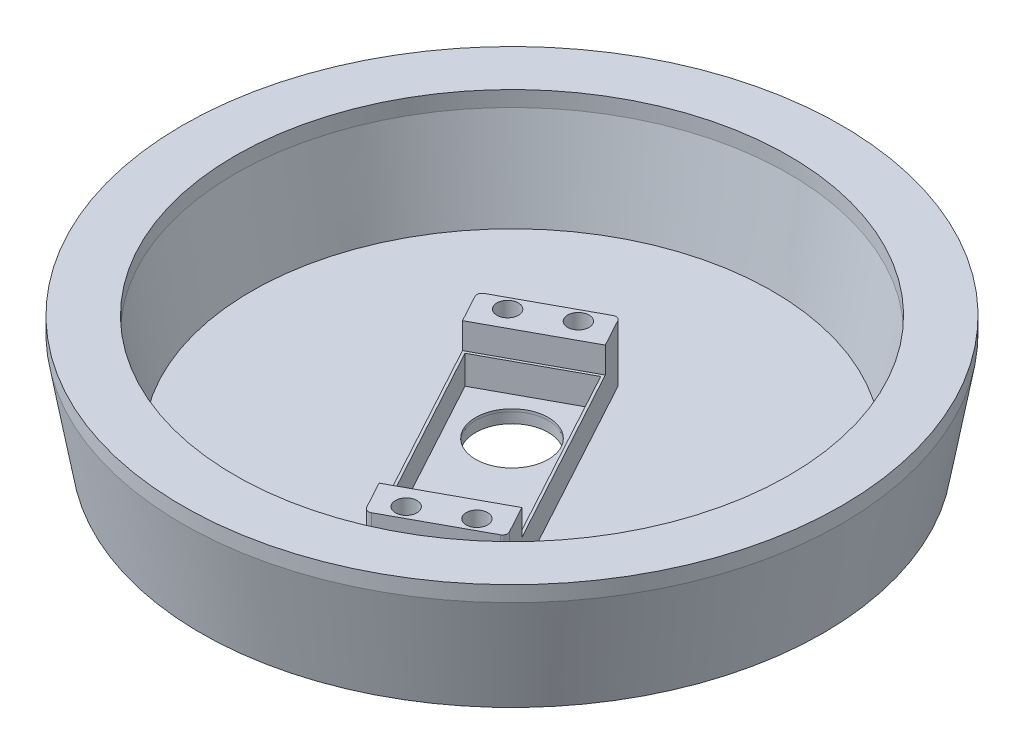
ISO-10303-21;
HEADER;
FILE_DESCRIPTION(('STEP AP214'),'2;1');
FILE_NAME('part.step','',(''),(''),'','','');
FILE_SCHEMA(('AUTOMOTIVE_DESIGN { 1 0 10303 214 1 1 1 1 }'));
ENDSEC;
DATA;
#1=APPLICATION_CONTEXT('core data for automotive mechanical design processes');
#2=APPLICATION_PROTOCOL_DEFINITION('international standard','automotive_design',2000,#1);
#3=PRODUCT_CONTEXT('',#1,'mechanical');
#4=PRODUCT('Part','Part','',(#3));
#5=PRODUCT_RELATED_PRODUCT_CATEGORY('part','',(#4));
#6=PRODUCT_DEFINITION_FORMATION('','',#4);
#7=PRODUCT_DEFINITION_CONTEXT('part definition',#1,'design');
#8=PRODUCT_DEFINITION('design','',#6,#7);
#9=PRODUCT_DEFINITION_SHAPE('','',#8);
#10=(LENGTH_UNIT() NAMED_UNIT(*) SI_UNIT(.MILLI.,.METRE.));
#11=(NAMED_UNIT(*) PLANE_ANGLE_UNIT() SI_UNIT($,.RADIAN.));
#12=(NAMED_UNIT(*) SI_UNIT($,.STERADIAN.) SOLID_ANGLE_UNIT());
#13=UNCERTAINTY_MEASURE_WITH_UNIT(LENGTH_MEASURE(1.E-05),#10,'distance_accuracy_value','');
#14=(GEOMETRIC_REPRESENTATION_CONTEXT(3) GLOBAL_UNCERTAINTY_ASSIGNED_CONTEXT((#13)) GLOBAL_UNIT_ASSIGNED_CONTEXT((#10,
#11,#12)) REPRESENTATION_CONTEXT('',''));
#15=CARTESIAN_POINT('',(0.,0.,0.));
#16=DIRECTION('',(0.,0.,1.));
#17=DIRECTION('',(1.,0.,0.));
#18=AXIS2_PLACEMENT_3D('',#15,#16,#17);
#19=CARTESIAN_POINT('',(0.,2.91535844703788,0.));
#20=DIRECTION('',(0.,-1.,0.));
#21=DIRECTION('',(0.,0.,-1.));
#22=AXIS2_PLACEMENT_3D('',#19,#20,#21);
#23=PLANE('',#22);
#24=CARTESIAN_POINT('',(33.858241892739,2.91535844703787,67.4128576557547));
#25=DIRECTION('',(0.,-1.,0.));
#26=DIRECTION('',(0.,0.,-1.));
#27=AXIS2_PLACEMENT_3D('',#24,#25,#26);
#28=CIRCLE('',#27,2.07007526452973);
#29=CARTESIAN_POINT('',(33.858241892739,2.91535844703787,65.342782391225));
#30=VERTEX_POINT('',#29);
#31=EDGE_CURVE('P0_E402',#30,#30,#28,.T.);
#32=ORIENTED_EDGE('',*,*,#31,.F.);
#33=EDGE_LOOP('',(#32));
#34=FACE_BOUND('',#33,.T.);
#35=CARTESIAN_POINT('',(25.0251475464195,2.91535844703786,72.2064934647227));
#36=DIRECTION('',(0.,-1.,0.));
#37=DIRECTION('',(0.,0.,-1.));
#38=AXIS2_PLACEMENT_3D('',#35,#36,#37);
#39=CIRCLE('',#38,2.07007526452973);
#40=CARTESIAN_POINT('',(25.0251475464195,2.91535844703786,70.1364182001929));
#41=VERTEX_POINT('',#40);
#42=EDGE_CURVE('P0_E404',#41,#41,#39,.T.);
#43=ORIENTED_EDGE('',*,*,#42,.F.);
#44=EDGE_LOOP('',(#43));
#45=FACE_BOUND('',#44,.T.);
#46=CARTESIAN_POINT('',(10.6571970895138,2.91535844703787,24.6609620493601));
#47=DIRECTION('',(0.,-1.,0.));
#48=DIRECTION('',(0.,0.,-1.));
#49=AXIS2_PLACEMENT_3D('',#46,#47,#48);
#50=CIRCLE('',#49,2.07007526452973);
#51=CARTESIAN_POINT('',(10.6571970895138,2.91535844703787,22.5908867848304));
#52=VERTEX_POINT('',#51);
#53=EDGE_CURVE('P0_E412',#52,#52,#50,.T.);
#54=ORIENTED_EDGE('',*,*,#53,.F.);
#55=EDGE_LOOP('',(#54));
#56=FACE_BOUND('',#55,.T.);
#57=CARTESIAN_POINT('',(1.82410274319434,2.91535844703787,29.454597858328));
#58=DIRECTION('',(0.,-1.,0.));
#59=DIRECTION('',(0.,0.,-1.));
#60=AXIS2_PLACEMENT_3D('',#57,#58,#59);
#61=CIRCLE('',#60,2.07007526452973);
#62=CARTESIAN_POINT('',(1.82410274319434,2.91535844703787,27.3845225937983));
#63=VERTEX_POINT('',#62);
#64=EDGE_CURVE('P0_E418',#63,#63,#61,.T.);
#65=ORIENTED_EDGE('',*,*,#64,.F.);
#66=EDGE_LOOP('',(#65));
#67=FACE_BOUND('',#66,.T.);
#68=DIRECTION('',(0.878914860330292,0.,-0.476978687459496));
#69=VECTOR('',#68,1.);
#70=CARTESIAN_POINT('',(-3.94074804810234,2.91535844703787,29.5765885750462));
#71=LINE('',#70,#69);
#72=CARTESIAN_POINT('',(-3.06183318777204,2.91535844703787,29.0996098875868));
#73=VERTEX_POINT('',#72);
#74=CARTESIAN_POINT('',(13.0223087562723,2.91535844703787,20.370899907078));
#75=VERTEX_POINT('',#74);
#76=EDGE_CURVE('P0_E210',#73,#75,#71,.T.);
#77=ORIENTED_EDGE('',*,*,#76,.T.);
#78=CARTESIAN_POINT('',(13.4992874437318,2.91535844703788,21.2498147674083));
#79=DIRECTION('',(0.,-1.,0.));
#80=DIRECTION('',(0.,0.,-1.));
#81=AXIS2_PLACEMENT_3D('',#78,#79,#80);
#82=CIRCLE('',#81,1.);
#83=CARTESIAN_POINT('',(14.3782023040621,2.91535844703787,20.7728360799488));
#84=VERTEX_POINT('',#83);
#85=EDGE_CURVE('P0_E252',#75,#84,#82,.T.);
#86=ORIENTED_EDGE('',*,*,#85,.T.);
#87=DIRECTION('',(0.476978687459496,0.,0.878914860330292));
#88=VECTOR('',#87,1.);
#89=CARTESIAN_POINT('',(13.9012236166026,2.91535844703787,19.8939212196185));
#90=LINE('',#89,#88);
#91=CARTESIAN_POINT('',(39.1810940519559,2.91535844703787,66.476408817124));
#92=VERTEX_POINT('',#91);
#93=EDGE_CURVE('P0_E226',#84,#92,#90,.T.);
#94=ORIENTED_EDGE('',*,*,#93,.T.);
#95=CARTESIAN_POINT('',(38.3021791916256,2.91535844703787,66.9533875045835));
#96=DIRECTION('',(0.,-1.,0.));
#97=DIRECTION('',(0.,0.,-1.));
#98=AXIS2_PLACEMENT_3D('',#95,#96,#97);
#99=CIRCLE('',#98,1.);
#100=CARTESIAN_POINT('',(38.7791578790851,2.91535844703787,67.8323023649138));
#101=VERTEX_POINT('',#100);
#102=EDGE_CURVE('P0_E248',#92,#101,#99,.T.);
#103=ORIENTED_EDGE('',*,*,#102,.T.);
#104=DIRECTION('',(-0.878914860330292,0.,0.476978687459495));
#105=VECTOR('',#104,1.);
#106=CARTESIAN_POINT('',(39.6580727394154,2.91535844703787,67.3553236774543));
#107=LINE('',#106,#105);
#108=CARTESIAN_POINT('',(22.6950159350407,2.91535844703787,76.5610123454225));
#109=VERTEX_POINT('',#108);
#110=EDGE_CURVE('P0_E229',#101,#109,#107,.T.);
#111=ORIENTED_EDGE('',*,*,#110,.T.);
#112=CARTESIAN_POINT('',(22.2180372475812,2.91535844703787,75.6820974850922));
#113=DIRECTION('',(0.,-1.,0.));
#114=DIRECTION('',(0.,0.,-1.));
#115=AXIS2_PLACEMENT_3D('',#112,#113,#114);
#116=CIRCLE('',#115,1.);
#117=CARTESIAN_POINT('',(21.3391223872509,2.91535844703787,76.1590761725517));
#118=VERTEX_POINT('',#117);
#119=EDGE_CURVE('P0_E246',#109,#118,#116,.T.);
#120=ORIENTED_EDGE('',*,*,#119,.T.);
#121=DIRECTION('',(-0.476978687459496,0.,-0.878914860330292));
#122=VECTOR('',#121,1.);
#123=CARTESIAN_POINT('',(21.8161010747104,2.91535844703787,77.037991032882));
#124=LINE('',#123,#122);
#125=CARTESIAN_POINT('',(-3.46376936064285,2.91535844703787,30.4555034353765));
#126=VERTEX_POINT('',#125);
#127=EDGE_CURVE('P0_E215',#118,#126,#124,.T.);
#128=ORIENTED_EDGE('',*,*,#127,.T.);
#129=CARTESIAN_POINT('',(-2.58485450031255,2.91535844703787,29.978524747917));
#130=DIRECTION('',(0.,-1.,0.));
#131=DIRECTION('',(0.,0.,-1.));
#132=AXIS2_PLACEMENT_3D('',#129,#130,#131);
#133=CIRCLE('',#132,1.);
#134=EDGE_CURVE('P0_E250',#126,#73,#133,.T.);
#135=ORIENTED_EDGE('',*,*,#134,.T.);
#136=EDGE_LOOP('',(#77,#86,#94,#103,#111,#120,#128,#135));
#137=FACE_BOUND('',#136,.T.);
#138=CARTESIAN_POINT('',(13.3273648147913,2.91535844703787,40.1162649531125));
#139=DIRECTION('',(0.,1.,0.));
#140=DIRECTION('',(0.,0.,1.));
#141=AXIS2_PLACEMENT_3D('',#138,#139,#140);
#142=CIRCLE('',#141,6.99999999999998);
#143=CARTESIAN_POINT('',(13.3273648147913,2.91535844703787,47.1162649531125));
#144=VERTEX_POINT('',#143);
#145=EDGE_CURVE('P0_E177',#144,#144,#142,.T.);
#146=ORIENTED_EDGE('',*,*,#145,.T.);
#147=EDGE_LOOP('',(#146));
#148=FACE_BOUND('',#147,.T.);
#149=ADVANCED_FACE('P0_F34',(#34,#45,#56,#67,#137,#148),#23,.T.);
#150=CARTESIAN_POINT('',(0.,13.9153584470379,0.));
#151=DIRECTION('',(0.,-1.,0.));
#152=DIRECTION('',(0.,0.,-1.));
#153=AXIS2_PLACEMENT_3D('',#150,#151,#152);
#154=PLANE('',#153);
#155=CARTESIAN_POINT('',(33.858241892739,13.9153584470379,67.4128576557547));
#156=DIRECTION('',(0.,-1.,0.));
#157=DIRECTION('',(0.,0.,-1.));
#158=AXIS2_PLACEMENT_3D('',#155,#156,#157);
#159=CIRCLE('',#158,2.07007526452972);
#160=CARTESIAN_POINT('',(33.858241892739,13.9153584470379,65.342782391225));
#161=VERTEX_POINT('',#160);
#162=EDGE_CURVE('P0_E400',#161,#161,#159,.T.);
#163=ORIENTED_EDGE('',*,*,#162,.T.);
#164=EDGE_LOOP('',(#163));
#165=FACE_BOUND('',#164,.T.);
#166=CARTESIAN_POINT('',(25.0251475464195,13.9153584470379,72.2064934647227));
#167=DIRECTION('',(0.,-1.,0.));
#168=DIRECTION('',(0.,0.,-1.));
#169=AXIS2_PLACEMENT_3D('',#166,#167,#168);
#170=CIRCLE('',#169,2.07007526452972);
#171=CARTESIAN_POINT('',(25.0251475464195,13.9153584470379,70.1364182001929));
#172=VERTEX_POINT('',#171);
#173=EDGE_CURVE('P0_E409',#172,#172,#170,.T.);
#174=ORIENTED_EDGE('',*,*,#173,.T.);
#175=EDGE_LOOP('',(#174));
#176=FACE_BOUND('',#175,.T.);
#177=DIRECTION('',(-0.878914860330292,0.,0.476978687459495));
#178=VECTOR('',#177,1.);
#179=CARTESIAN_POINT('',(39.6580727394154,13.9153584470379,67.3553236774543));
#180=LINE('',#179,#178);
#181=CARTESIAN_POINT('',(38.7791578790851,13.9153584470379,67.8323023649138));
#182=VERTEX_POINT('',#181);
#183=CARTESIAN_POINT('',(22.6950159350407,13.9153584470379,76.5610123454225));
#184=VERTEX_POINT('',#183);
#185=EDGE_CURVE('P0_E218',#182,#184,#180,.T.);
#186=ORIENTED_EDGE('',*,*,#185,.F.);
#187=CARTESIAN_POINT('',(38.3021791916256,13.9153584470379,66.9533875045835));
#188=DIRECTION('',(0.,-1.,0.));
#189=DIRECTION('',(0.,0.,-1.));
#190=AXIS2_PLACEMENT_3D('',#187,#188,#189);
#191=CIRCLE('',#190,1.);
#192=CARTESIAN_POINT('',(39.1810940519559,13.9153584470379,66.476408817124));
#193=VERTEX_POINT('',#192);
#194=EDGE_CURVE('P0_E11',#182,#193,#191,.F.);
#195=ORIENTED_EDGE('',*,*,#194,.T.);
#196=DIRECTION('',(0.476978687459496,0.,0.878914860330292));
#197=VECTOR('',#196,1.);
#198=CARTESIAN_POINT('',(13.9012236166026,13.9153584470379,19.8939212196185));
#199=LINE('',#198,#197);
#200=CARTESIAN_POINT('',(36.3192219271989,13.9153584470379,61.2029196551422));
#201=VERTEX_POINT('',#200);
#202=EDGE_CURVE('P0_E214',#201,#193,#199,.T.);
#203=ORIENTED_EDGE('',*,*,#202,.F.);
#204=DIRECTION('',(-0.878914860330292,0.,0.476978687459496));
#205=VECTOR('',#204,1.);
#206=CARTESIAN_POINT('',(33.9206495784136,13.9153584470379,62.5046019253342));
#207=LINE('',#206,#205);
#208=CARTESIAN_POINT('',(18.4772502624939,13.9153584470379,70.88558701057));
#209=VERTEX_POINT('',#208);
#210=EDGE_CURVE('P0_E236',#201,#209,#207,.T.);
#211=ORIENTED_EDGE('',*,*,#210,.T.);
#212=DIRECTION('',(-0.476978687459496,0.,-0.878914860330292));
#213=VECTOR('',#212,1.);
#214=CARTESIAN_POINT('',(21.8161010747104,13.9153584470379,77.037991032882));
#215=LINE('',#214,#213);
#216=CARTESIAN_POINT('',(21.3391223872509,13.9153584470379,76.1590761725517));
#217=VERTEX_POINT('',#216);
#218=EDGE_CURVE('P0_E221',#217,#209,#215,.T.);
#219=ORIENTED_EDGE('',*,*,#218,.F.);
#220=CARTESIAN_POINT('',(22.2180372475812,13.9153584470379,75.6820974850922));
#221=DIRECTION('',(0.,-1.,0.));
#222=DIRECTION('',(0.,0.,-1.));
#223=AXIS2_PLACEMENT_3D('',#220,#221,#222);
#224=CIRCLE('',#223,1.);
#225=EDGE_CURVE('P0_E42',#217,#184,#224,.F.);
#226=ORIENTED_EDGE('',*,*,#225,.T.);
#227=EDGE_LOOP('',(#186,#195,#203,#211,#219,#226));
#228=FACE_BOUND('',#227,.T.);
#229=ADVANCED_FACE('P0_F289',(#165,#176,#228),#154,.F.);
#230=CARTESIAN_POINT('',(-3.94074804810234,13.9153584470379,29.5765885750462));
#231=DIRECTION('',(-0.476978687459496,0.,-0.878914860330292));
#232=DIRECTION('',(-0.878914860330292,0.,0.476978687459496));
#233=AXIS2_PLACEMENT_3D('',#230,#231,#232);
#234=PLANE('',#233);
#235=DIRECTION('',(0.878914860330292,0.,-0.476978687459496));
#236=VECTOR('',#235,1.);
#237=CARTESIAN_POINT('',(-3.94074804810234,13.9153584470379,29.5765885750462));
#238=LINE('',#237,#236);
#239=CARTESIAN_POINT('',(-3.06183318777204,13.9153584470379,29.0996098875868));
#240=VERTEX_POINT('',#239);
#241=CARTESIAN_POINT('',(13.0223087562723,13.9153584470379,20.370899907078));
#242=VERTEX_POINT('',#241);
#243=EDGE_CURVE('P0_E211',#240,#242,#238,.T.);
#244=ORIENTED_EDGE('',*,*,#243,.T.);
#245=DIRECTION('',(0.,-1.,0.));
#246=VECTOR('',#245,1.);
#247=CARTESIAN_POINT('',(13.0223087562723,13.9153584470379,20.370899907078));
#248=LINE('',#247,#246);
#249=EDGE_CURVE('P0_E243',#242,#75,#248,.T.);
#250=ORIENTED_EDGE('',*,*,#249,.T.);
#251=ORIENTED_EDGE('',*,*,#76,.F.);
#252=DIRECTION('',(0.,-1.,0.));
#253=VECTOR('',#252,1.);
#254=CARTESIAN_POINT('',(-3.06183318777204,13.9153584470379,29.0996098875868));
#255=LINE('',#254,#253);
#256=EDGE_CURVE('P0_E241',#73,#240,#255,.F.);
#257=ORIENTED_EDGE('',*,*,#256,.T.);
#258=EDGE_LOOP('',(#244,#250,#251,#257));
#259=FACE_BOUND('',#258,.T.);
#260=ADVANCED_FACE('P0_F311',(#259),#234,.T.);
#261=CARTESIAN_POINT('',(21.8161010747104,13.9153584470379,77.037991032882));
#262=DIRECTION('',(-0.878914860330292,0.,0.476978687459496));
#263=DIRECTION('',(0.476978687459496,0.,0.878914860330292));
#264=AXIS2_PLACEMENT_3D('',#261,#262,#263);
#265=PLANE('',#264);
#266=CARTESIAN_POINT('',(-0.601897235885876,13.9153584470379,35.7289925973583));
#267=VERTEX_POINT('',#266);
#268=CARTESIAN_POINT('',(-3.46376936064285,13.9153584470379,30.4555034353765));
#269=VERTEX_POINT('',#268);
#270=EDGE_CURVE('P0_E220',#267,#269,#215,.T.);
#271=ORIENTED_EDGE('',*,*,#270,.T.);
#272=DIRECTION('',(0.,-1.,0.));
#273=VECTOR('',#272,1.);
#274=CARTESIAN_POINT('',(-3.46376936064285,13.9153584470379,30.4555034353765));
#275=LINE('',#274,#273);
#276=EDGE_CURVE('P0_E265',#269,#126,#275,.T.);
#277=ORIENTED_EDGE('',*,*,#276,.T.);
#278=ORIENTED_EDGE('',*,*,#127,.F.);
#279=DIRECTION('',(0.,-1.,0.));
#280=VECTOR('',#279,1.);
#281=CARTESIAN_POINT('',(21.3391223872509,13.9153584470379,76.1590761725517));
#282=LINE('',#281,#280);
#283=EDGE_CURVE('P0_E263',#118,#217,#282,.F.);
#284=ORIENTED_EDGE('',*,*,#283,.T.);
#285=ORIENTED_EDGE('',*,*,#218,.T.);
#286=DIRECTION('',(0.,1.,0.));
#287=VECTOR('',#286,1.);
#288=CARTESIAN_POINT('',(18.4772502624939,8.91535844703787,70.88558701057));
#289=LINE('',#288,#287);
#290=CARTESIAN_POINT('',(18.4772502624939,8.91535844703787,70.88558701057));
#291=VERTEX_POINT('',#290);
#292=EDGE_CURVE('P0_E198',#291,#209,#289,.T.);
#293=ORIENTED_EDGE('',*,*,#292,.F.);
#294=DIRECTION('',(0.476978687459496,0.,0.878914860330292));
#295=VECTOR('',#294,1.);
#296=CARTESIAN_POINT('',(-0.601897235885876,8.91535844703787,35.7289925973583));
#297=LINE('',#296,#295);
#298=CARTESIAN_POINT('',(-0.601897235885876,8.91535844703787,35.7289925973583));
#299=VERTEX_POINT('',#298);
#300=EDGE_CURVE('P0_E195',#299,#291,#297,.T.);
#301=ORIENTED_EDGE('',*,*,#300,.F.);
#302=DIRECTION('',(0.,-1.,0.));
#303=VECTOR('',#302,1.);
#304=CARTESIAN_POINT('',(-0.601897235885876,13.9153584470379,35.7289925973583));
#305=LINE('',#304,#303);
#306=EDGE_CURVE('P0_E189',#267,#299,#305,.T.);
#307=ORIENTED_EDGE('',*,*,#306,.F.);
#308=EDGE_LOOP('',(#271,#277,#278,#284,#285,#293,#301,#307));
#309=FACE_BOUND('',#308,.T.);
#310=ADVANCED_FACE('P0_F297',(#309),#265,.T.);
#311=CARTESIAN_POINT('',(39.6580727394154,13.9153584470379,67.3553236774543));
#312=DIRECTION('',(0.476978687459495,0.,0.878914860330292));
#313=DIRECTION('',(0.878914860330293,0.,-0.476978687459495));
#314=AXIS2_PLACEMENT_3D('',#311,#312,#313);
#315=PLANE('',#314);
#316=ORIENTED_EDGE('',*,*,#110,.F.);
#317=DIRECTION('',(0.,-1.,0.));
#318=VECTOR('',#317,1.);
#319=CARTESIAN_POINT('',(38.7791578790851,13.9153584470379,67.8323023649138));
#320=LINE('',#319,#318);
#321=EDGE_CURVE('P0_E55',#101,#182,#320,.F.);
#322=ORIENTED_EDGE('',*,*,#321,.T.);
#323=ORIENTED_EDGE('',*,*,#185,.T.);
#324=DIRECTION('',(0.,-1.,0.));
#325=VECTOR('',#324,1.);
#326=CARTESIAN_POINT('',(22.6950159350407,13.9153584470379,76.5610123454225));
#327=LINE('',#326,#325);
#328=EDGE_CURVE('P0_E268',#184,#109,#327,.T.);
#329=ORIENTED_EDGE('',*,*,#328,.T.);
#330=EDGE_LOOP('',(#316,#322,#323,#329));
#331=FACE_BOUND('',#330,.T.);
#332=ADVANCED_FACE('P0_F272',(#331),#315,.T.);
#333=CARTESIAN_POINT('',(13.9012236166026,13.9153584470379,19.8939212196185));
#334=DIRECTION('',(0.878914860330292,0.,-0.476978687459496));
#335=DIRECTION('',(-0.476978687459496,0.,-0.878914860330292));
#336=AXIS2_PLACEMENT_3D('',#333,#334,#335);
#337=PLANE('',#336);
#338=ORIENTED_EDGE('',*,*,#93,.F.);
#339=DIRECTION('',(0.,-1.,0.));
#340=VECTOR('',#339,1.);
#341=CARTESIAN_POINT('',(14.3782023040621,13.9153584470379,20.7728360799488));
#342=LINE('',#341,#340);
#343=CARTESIAN_POINT('',(14.3782023040621,13.9153584470379,20.7728360799488));
#344=VERTEX_POINT('',#343);
#345=EDGE_CURVE('P0_E257',#84,#344,#342,.F.);
#346=ORIENTED_EDGE('',*,*,#345,.T.);
#347=CARTESIAN_POINT('',(17.2400744288191,13.9153584470379,26.0463252419305));
#348=VERTEX_POINT('',#347);
#349=EDGE_CURVE('P0_E216',#344,#348,#199,.T.);
#350=ORIENTED_EDGE('',*,*,#349,.T.);
#351=DIRECTION('',(0.,1.,0.));
#352=VECTOR('',#351,1.);
#353=CARTESIAN_POINT('',(17.2400744288191,13.9153584470379,26.0463252419305));
#354=LINE('',#353,#352);
#355=CARTESIAN_POINT('',(17.2400744288191,8.91535844703787,26.0463252419305));
#356=VERTEX_POINT('',#355);
#357=EDGE_CURVE('P0_E204',#356,#348,#354,.T.);
#358=ORIENTED_EDGE('',*,*,#357,.F.);
#359=DIRECTION('',(-0.476978687459496,0.,-0.878914860330292));
#360=VECTOR('',#359,1.);
#361=CARTESIAN_POINT('',(13.9012236166026,8.91535844703787,19.8939212196185));
#362=LINE('',#361,#360);
#363=CARTESIAN_POINT('',(36.3192219271989,8.91535844703787,61.2029196551422));
#364=VERTEX_POINT('',#363);
#365=EDGE_CURVE('P0_E239',#364,#356,#362,.T.);
#366=ORIENTED_EDGE('',*,*,#365,.F.);
#367=DIRECTION('',(0.,-1.,0.));
#368=VECTOR('',#367,1.);
#369=CARTESIAN_POINT('',(36.3192219271989,13.9153584470379,61.2029196551422));
#370=LINE('',#369,#368);
#371=EDGE_CURVE('P0_E208',#201,#364,#370,.T.);
#372=ORIENTED_EDGE('',*,*,#371,.F.);
#373=ORIENTED_EDGE('',*,*,#202,.T.);
#374=DIRECTION('',(0.,-1.,0.));
#375=VECTOR('',#374,1.);
#376=CARTESIAN_POINT('',(39.1810940519559,13.9153584470379,66.476408817124));
#377=LINE('',#376,#375);
#378=EDGE_CURVE('P0_E254',#193,#92,#377,.T.);
#379=ORIENTED_EDGE('',*,*,#378,.T.);
#380=EDGE_LOOP('',(#338,#346,#350,#358,#366,#372,#373,#379));
#381=FACE_BOUND('',#380,.T.);
#382=ADVANCED_FACE('P0_F284',(#381),#337,.T.);
#383=CARTESIAN_POINT('',(10.6571970895138,13.9153584470379,24.6609620493601));
#384=DIRECTION('',(0.,-1.,0.));
#385=DIRECTION('',(0.,0.,-1.));
#386=AXIS2_PLACEMENT_3D('',#383,#384,#385);
#387=CIRCLE('',#386,2.07007526452972);
#388=CARTESIAN_POINT('',(10.6571970895138,13.9153584470379,22.5908867848304));
#389=VERTEX_POINT('',#388);
#390=EDGE_CURVE('P0_E415',#389,#389,#387,.T.);
#391=ORIENTED_EDGE('',*,*,#390,.T.);
#392=EDGE_LOOP('',(#391));
#393=FACE_BOUND('',#392,.T.);
#394=CARTESIAN_POINT('',(1.82410274319434,13.9153584470379,29.454597858328));
#395=DIRECTION('',(0.,-1.,0.));
#396=DIRECTION('',(0.,0.,-1.));
#397=AXIS2_PLACEMENT_3D('',#394,#395,#396);
#398=CIRCLE('',#397,2.07007526452972);
#399=CARTESIAN_POINT('',(1.82410274319434,13.9153584470379,27.3845225937983));
#400=VERTEX_POINT('',#399);
#401=EDGE_CURVE('P0_E421',#400,#400,#398,.T.);
#402=ORIENTED_EDGE('',*,*,#401,.T.);
#403=EDGE_LOOP('',(#402));
#404=FACE_BOUND('',#403,.T.);
#405=ORIENTED_EDGE('',*,*,#349,.F.);
#406=CARTESIAN_POINT('',(13.4992874437318,13.9153584470379,21.2498147674083));
#407=DIRECTION('',(0.,-1.,0.));
#408=DIRECTION('',(0.,0.,-1.));
#409=AXIS2_PLACEMENT_3D('',#406,#407,#408);
#410=CIRCLE('',#409,1.);
#411=EDGE_CURVE('P0_E261',#344,#242,#410,.F.);
#412=ORIENTED_EDGE('',*,*,#411,.T.);
#413=ORIENTED_EDGE('',*,*,#243,.F.);
#414=CARTESIAN_POINT('',(-2.58485450031255,13.9153584470379,29.978524747917));
#415=DIRECTION('',(0.,-1.,0.));
#416=DIRECTION('',(0.,0.,-1.));
#417=AXIS2_PLACEMENT_3D('',#414,#415,#416);
#418=CIRCLE('',#417,1.);
#419=EDGE_CURVE('P0_E259',#240,#269,#418,.F.);
#420=ORIENTED_EDGE('',*,*,#419,.T.);
#421=ORIENTED_EDGE('',*,*,#270,.F.);
#422=DIRECTION('',(0.878914860330292,0.,-0.476978687459496));
#423=VECTOR('',#422,1.);
#424=CARTESIAN_POINT('',(14.8415020800338,13.9153584470379,27.3480075121225));
#425=LINE('',#424,#423);
#426=EDGE_CURVE('P0_E223',#267,#348,#425,.T.);
#427=ORIENTED_EDGE('',*,*,#426,.T.);
#428=EDGE_LOOP('',(#405,#412,#413,#420,#421,#427));
#429=FACE_BOUND('',#428,.T.);
#430=ADVANCED_FACE('P0_F314',(#393,#404,#429),#154,.F.);
#431=CARTESIAN_POINT('',(56.216164606719,8.91535844703787,50.4050391867566));
#432=DIRECTION('',(0.476978687459496,0.,0.878914860330292));
#433=DIRECTION('',(0.878914860330292,0.,-0.476978687459496));
#434=AXIS2_PLACEMENT_3D('',#431,#432,#433);
#435=PLANE('',#434);
#436=ORIENTED_EDGE('',*,*,#371,.T.);
#437=DIRECTION('',(-0.878914860330292,0.,0.476978687459496));
#438=VECTOR('',#437,1.);
#439=CARTESIAN_POINT('',(56.216164606719,8.91535844703787,50.4050391867566));
#440=LINE('',#439,#438);
#441=EDGE_CURVE('P0_E202',#364,#291,#440,.T.);
#442=ORIENTED_EDGE('',*,*,#441,.T.);
#443=ORIENTED_EDGE('',*,*,#292,.T.);
#444=ORIENTED_EDGE('',*,*,#210,.F.);
#445=EDGE_LOOP('',(#436,#442,#443,#444));
#446=FACE_BOUND('',#445,.T.);
#447=ADVANCED_FACE('P0_F291',(#446),#435,.F.);
#448=CARTESIAN_POINT('',(37.1370171083392,8.91535844703787,15.2484447735449));
#449=DIRECTION('',(0.,-1.,0.));
#450=DIRECTION('',(0.,0.,-1.));
#451=AXIS2_PLACEMENT_3D('',#448,#449,#450);
#452=PLANE('',#451);
#453=DIRECTION('',(-0.476978687459496,0.,-0.878914860330292));
#454=VECTOR('',#453,1.);
#455=CARTESIAN_POINT('',(35.641275153304,8.91535844703787,61.0019515687068));
#456=LINE('',#455,#454);
#457=CARTESIAN_POINT('',(35.641275153304,8.91535844703787,61.0019515687068));
#458=VERTEX_POINT('',#457);
#459=CARTESIAN_POINT('',(17.0391063423837,8.91535844703787,26.7242720158254));
#460=VERTEX_POINT('',#459);
#461=EDGE_CURVE('P0_E183',#458,#460,#456,.T.);
#462=ORIENTED_EDGE('',*,*,#461,.F.);
#463=DIRECTION('',(0.878914860330292,0.,-0.476978687459496));
#464=VECTOR('',#463,1.);
#465=CARTESIAN_POINT('',(18.6782183489294,8.91535844703787,70.2076402366751));
#466=LINE('',#465,#464);
#467=CARTESIAN_POINT('',(18.6782183489294,8.91535844703787,70.2076402366751));
#468=VERTEX_POINT('',#467);
#469=EDGE_CURVE('P0_E154',#468,#458,#466,.T.);
#470=ORIENTED_EDGE('',*,*,#469,.F.);
#471=DIRECTION('',(0.476978687459496,0.,0.878914860330292));
#472=VECTOR('',#471,1.);
#473=CARTESIAN_POINT('',(0.0760495380090244,8.91535844703787,35.9299606837937));
#474=LINE('',#473,#472);
#475=CARTESIAN_POINT('',(0.0760495380090244,8.91535844703787,35.9299606837937));
#476=VERTEX_POINT('',#475);
#477=EDGE_CURVE('P0_E171',#476,#468,#474,.T.);
#478=ORIENTED_EDGE('',*,*,#477,.F.);
#479=DIRECTION('',(-0.878914860330292,0.,0.476978687459496));
#480=VECTOR('',#479,1.);
#481=CARTESIAN_POINT('',(17.0391063423837,8.91535844703787,26.7242720158254));
#482=LINE('',#481,#480);
#483=EDGE_CURVE('P0_E174',#460,#476,#482,.T.);
#484=ORIENTED_EDGE('',*,*,#483,.F.);
#485=EDGE_LOOP('',(#462,#470,#478,#484));
#486=FACE_BOUND('',#485,.T.);
#487=ORIENTED_EDGE('',*,*,#365,.T.);
#488=DIRECTION('',(-0.878914860330292,0.,0.476978687459496));
#489=VECTOR('',#488,1.);
#490=CARTESIAN_POINT('',(37.1370171083392,8.91535844703787,15.2484447735449));
#491=LINE('',#490,#489);
#492=EDGE_CURVE('P0_E201',#356,#299,#491,.T.);
#493=ORIENTED_EDGE('',*,*,#492,.T.);
#494=ORIENTED_EDGE('',*,*,#300,.T.);
#495=ORIENTED_EDGE('',*,*,#441,.F.);
#496=EDGE_LOOP('',(#487,#493,#494,#495));
#497=FACE_BOUND('',#496,.T.);
#498=ADVANCED_FACE('P0_F352',(#486,#497),#452,.F.);
#499=CARTESIAN_POINT('',(37.1370171083392,13.9153584470379,15.2484447735449));
#500=DIRECTION('',(-0.476978687459496,0.,-0.878914860330292));
#501=DIRECTION('',(-0.878914860330292,0.,0.476978687459496));
#502=AXIS2_PLACEMENT_3D('',#499,#500,#501);
#503=PLANE('',#502);
#504=ORIENTED_EDGE('',*,*,#357,.T.);
#505=ORIENTED_EDGE('',*,*,#426,.F.);
#506=ORIENTED_EDGE('',*,*,#306,.T.);
#507=ORIENTED_EDGE('',*,*,#492,.F.);
#508=EDGE_LOOP('',(#504,#505,#506,#507));
#509=FACE_BOUND('',#508,.T.);
#510=ADVANCED_FACE('P0_F346',(#509),#503,.F.);
#511=CARTESIAN_POINT('',(18.6782183489294,3.41535844703787,70.2076402366751));
#512=DIRECTION('',(0.476978687459496,0.,0.878914860330292));
#513=DIRECTION('',(0.878914860330292,0.,-0.476978687459496));
#514=AXIS2_PLACEMENT_3D('',#511,#512,#513);
#515=PLANE('',#514);
#516=ORIENTED_EDGE('',*,*,#469,.T.);
#517=DIRECTION('',(0.,1.,0.));
#518=VECTOR('',#517,1.);
#519=CARTESIAN_POINT('',(35.641275153304,3.41535844703787,61.0019515687068));
#520=LINE('',#519,#518);
#521=CARTESIAN_POINT('',(35.641275153304,3.41535844703787,61.0019515687068));
#522=VERTEX_POINT('',#521);
#523=EDGE_CURVE('P0_E147',#522,#458,#520,.T.);
#524=ORIENTED_EDGE('',*,*,#523,.F.);
#525=DIRECTION('',(0.878914860330292,0.,-0.476978687459496));
#526=VECTOR('',#525,1.);
#527=CARTESIAN_POINT('',(18.6782183489294,3.41535844703787,70.2076402366751));
#528=LINE('',#527,#526);
#529=CARTESIAN_POINT('',(18.6782183489294,3.41535844703787,70.2076402366751));
#530=VERTEX_POINT('',#529);
#531=EDGE_CURVE('P0_E151',#530,#522,#528,.T.);
#532=ORIENTED_EDGE('',*,*,#531,.F.);
#533=DIRECTION('',(0.,1.,0.));
#534=VECTOR('',#533,1.);
#535=CARTESIAN_POINT('',(18.6782183489294,3.41535844703787,70.2076402366751));
#536=LINE('',#535,#534);
#537=EDGE_CURVE('P0_E187',#530,#468,#536,.T.);
#538=ORIENTED_EDGE('',*,*,#537,.T.);
#539=EDGE_LOOP('',(#516,#524,#532,#538));
#540=FACE_BOUND('',#539,.T.);
#541=ADVANCED_FACE('P0_F149',(#540),#515,.F.);
#542=CARTESIAN_POINT('',(0.0760495380090242,3.41535844703787,35.9299606837937));
#543=DIRECTION('',(-0.878914860330292,0.,0.476978687459496));
#544=DIRECTION('',(0.476978687459496,0.,0.878914860330292));
#545=AXIS2_PLACEMENT_3D('',#542,#543,#544);
#546=PLANE('',#545);
#547=ORIENTED_EDGE('',*,*,#477,.T.);
#548=ORIENTED_EDGE('',*,*,#537,.F.);
#549=DIRECTION('',(0.476978687459496,0.,0.878914860330292));
#550=VECTOR('',#549,1.);
#551=CARTESIAN_POINT('',(0.0760495380090242,3.41535844703787,35.9299606837937));
#552=LINE('',#551,#550);
#553=CARTESIAN_POINT('',(0.0760495380090242,3.41535844703787,35.9299606837937));
#554=VERTEX_POINT('',#553);
#555=EDGE_CURVE('P0_E159',#554,#530,#552,.T.);
#556=ORIENTED_EDGE('',*,*,#555,.F.);
#557=DIRECTION('',(0.,1.,0.));
#558=VECTOR('',#557,1.);
#559=CARTESIAN_POINT('',(0.0760495380090242,3.41535844703787,35.9299606837937));
#560=LINE('',#559,#558);
#561=EDGE_CURVE('P0_E190',#554,#476,#560,.T.);
#562=ORIENTED_EDGE('',*,*,#561,.T.);
#563=EDGE_LOOP('',(#547,#548,#556,#562));
#564=FACE_BOUND('',#563,.T.);
#565=ADVANCED_FACE('P0_F364',(#564),#546,.F.);
#566=CARTESIAN_POINT('',(17.0391063423837,3.41535844703787,26.7242720158254));
#567=DIRECTION('',(-0.476978687459496,0.,-0.878914860330292));
#568=DIRECTION('',(-0.878914860330292,0.,0.476978687459496));
#569=AXIS2_PLACEMENT_3D('',#566,#567,#568);
#570=PLANE('',#569);
#571=ORIENTED_EDGE('',*,*,#483,.T.);
#572=ORIENTED_EDGE('',*,*,#561,.F.);
#573=DIRECTION('',(-0.878914860330292,0.,0.476978687459496));
#574=VECTOR('',#573,1.);
#575=CARTESIAN_POINT('',(17.0391063423837,3.41535844703787,26.7242720158254));
#576=LINE('',#575,#574);
#577=CARTESIAN_POINT('',(17.0391063423837,3.41535844703787,26.7242720158254));
#578=VERTEX_POINT('',#577);
#579=EDGE_CURVE('P0_E167',#578,#554,#576,.T.);
#580=ORIENTED_EDGE('',*,*,#579,.F.);
#581=DIRECTION('',(0.,1.,0.));
#582=VECTOR('',#581,1.);
#583=CARTESIAN_POINT('',(17.0391063423837,3.41535844703787,26.7242720158254));
#584=LINE('',#583,#582);
#585=EDGE_CURVE('P0_E158',#578,#460,#584,.T.);
#586=ORIENTED_EDGE('',*,*,#585,.T.);
#587=EDGE_LOOP('',(#571,#572,#580,#586));
#588=FACE_BOUND('',#587,.T.);
#589=ADVANCED_FACE('P0_F367',(#588),#570,.F.);
#590=CARTESIAN_POINT('',(35.641275153304,3.41535844703787,61.0019515687068));
#591=DIRECTION('',(0.878914860330292,0.,-0.476978687459496));
#592=DIRECTION('',(-0.476978687459496,0.,-0.878914860330292));
#593=AXIS2_PLACEMENT_3D('',#590,#591,#592);
#594=PLANE('',#593);
#595=ORIENTED_EDGE('',*,*,#461,.T.);
#596=ORIENTED_EDGE('',*,*,#585,.F.);
#597=DIRECTION('',(-0.476978687459496,0.,-0.878914860330292));
#598=VECTOR('',#597,1.);
#599=CARTESIAN_POINT('',(35.641275153304,3.41535844703787,61.0019515687068));
#600=LINE('',#599,#598);
#601=EDGE_CURVE('P0_E162',#522,#578,#600,.T.);
#602=ORIENTED_EDGE('',*,*,#601,.F.);
#603=ORIENTED_EDGE('',*,*,#523,.T.);
#604=EDGE_LOOP('',(#595,#596,#602,#603));
#605=FACE_BOUND('',#604,.T.);
#606=ADVANCED_FACE('P0_F163',(#605),#594,.F.);
#607=CARTESIAN_POINT('',(0.,3.41535844703788,0.));
#608=DIRECTION('',(0.,1.,0.));
#609=DIRECTION('',(0.,0.,1.));
#610=AXIS2_PLACEMENT_3D('',#607,#608,#609);
#611=PLANE('',#610);
#612=CARTESIAN_POINT('',(13.3273648147913,3.41535844703788,40.1162649531125));
#613=DIRECTION('',(0.,1.,0.));
#614=DIRECTION('',(0.,0.,1.));
#615=AXIS2_PLACEMENT_3D('',#612,#613,#614);
#616=CIRCLE('',#615,6.99999999999998);
#617=CARTESIAN_POINT('',(13.3273648147913,3.41535844703787,47.1162649531125));
#618=VERTEX_POINT('',#617);
#619=EDGE_CURVE('P0_E423',#618,#618,#616,.T.);
#620=ORIENTED_EDGE('',*,*,#619,.F.);
#621=EDGE_LOOP('',(#620));
#622=FACE_BOUND('',#621,.T.);
#623=ORIENTED_EDGE('',*,*,#531,.T.);
#624=ORIENTED_EDGE('',*,*,#601,.T.);
#625=ORIENTED_EDGE('',*,*,#579,.T.);
#626=ORIENTED_EDGE('',*,*,#555,.T.);
#627=EDGE_LOOP('',(#623,#624,#625,#626));
#628=FACE_BOUND('',#627,.T.);
#629=ADVANCED_FACE('P0_F169',(#622,#628),#611,.T.);
#630=CARTESIAN_POINT('',(13.3273648147913,3.41535844703787,40.1162649531125));
#631=DIRECTION('',(0.,1.,0.));
#632=DIRECTION('',(0.,0.,1.));
#633=AXIS2_PLACEMENT_3D('',#630,#631,#632);
#634=CYLINDRICAL_SURFACE('',#633,6.99999999999998);
#635=ORIENTED_EDGE('',*,*,#145,.F.);
#636=EDGE_LOOP('',(#635));
#637=FACE_BOUND('',#636,.T.);
#638=ORIENTED_EDGE('',*,*,#619,.T.);
#639=EDGE_LOOP('',(#638));
#640=FACE_BOUND('',#639,.T.);
#641=ADVANCED_FACE('P0_F376',(#637,#640),#634,.F.);
#642=CARTESIAN_POINT('',(1.82410274319434,2.91535844703787,29.454597858328));
#643=DIRECTION('',(0.,-1.,0.));
#644=DIRECTION('',(0.,0.,-1.));
#645=AXIS2_PLACEMENT_3D('',#642,#643,#644);
#646=CYLINDRICAL_SURFACE('',#645,2.07007526452972);
#647=ORIENTED_EDGE('',*,*,#401,.F.);
#648=EDGE_LOOP('',(#647));
#649=FACE_BOUND('',#648,.T.);
#650=ORIENTED_EDGE('',*,*,#64,.T.);
#651=EDGE_LOOP('',(#650));
#652=FACE_BOUND('',#651,.T.);
#653=ADVANCED_FACE('P0_F380',(#649,#652),#646,.F.);
#654=CARTESIAN_POINT('',(10.6571970895138,2.91535844703787,24.6609620493601));
#655=DIRECTION('',(0.,-1.,0.));
#656=DIRECTION('',(0.,0.,-1.));
#657=AXIS2_PLACEMENT_3D('',#654,#655,#656);
#658=CYLINDRICAL_SURFACE('',#657,2.07007526452972);
#659=ORIENTED_EDGE('',*,*,#390,.F.);
#660=EDGE_LOOP('',(#659));
#661=FACE_BOUND('',#660,.T.);
#662=ORIENTED_EDGE('',*,*,#53,.T.);
#663=EDGE_LOOP('',(#662));
#664=FACE_BOUND('',#663,.T.);
#665=ADVANCED_FACE('P0_F384',(#661,#664),#658,.F.);
#666=CARTESIAN_POINT('',(25.0251475464195,2.91535844703787,72.2064934647227));
#667=DIRECTION('',(0.,-1.,0.));
#668=DIRECTION('',(0.,0.,-1.));
#669=AXIS2_PLACEMENT_3D('',#666,#667,#668);
#670=CYLINDRICAL_SURFACE('',#669,2.07007526452972);
#671=ORIENTED_EDGE('',*,*,#173,.F.);
#672=EDGE_LOOP('',(#671));
#673=FACE_BOUND('',#672,.T.);
#674=ORIENTED_EDGE('',*,*,#42,.T.);
#675=EDGE_LOOP('',(#674));
#676=FACE_BOUND('',#675,.T.);
#677=ADVANCED_FACE('P0_F388',(#673,#676),#670,.F.);
#678=CARTESIAN_POINT('',(33.858241892739,2.91535844703787,67.4128576557547));
#679=DIRECTION('',(0.,-1.,0.));
#680=DIRECTION('',(0.,0.,-1.));
#681=AXIS2_PLACEMENT_3D('',#678,#679,#680);
#682=CYLINDRICAL_SURFACE('',#681,2.07007526452973);
#683=ORIENTED_EDGE('',*,*,#162,.F.);
#684=EDGE_LOOP('',(#683));
#685=FACE_BOUND('',#684,.T.);
#686=ORIENTED_EDGE('',*,*,#31,.T.);
#687=EDGE_LOOP('',(#686));
#688=FACE_BOUND('',#687,.T.);
#689=ADVANCED_FACE('P0_F331',(#685,#688),#682,.F.);
#690=CARTESIAN_POINT('',(13.4992874437318,13.9153584470379,21.2498147674083));
#691=DIRECTION('',(0.,-1.,0.));
#692=DIRECTION('',(0.,0.,-1.));
#693=AXIS2_PLACEMENT_3D('',#690,#691,#692);
#694=CYLINDRICAL_SURFACE('',#693,1.);
#695=ORIENTED_EDGE('',*,*,#411,.F.);
#696=ORIENTED_EDGE('',*,*,#345,.F.);
#697=ORIENTED_EDGE('',*,*,#85,.F.);
#698=ORIENTED_EDGE('',*,*,#249,.F.);
#699=EDGE_LOOP('',(#695,#696,#697,#698));
#700=FACE_BOUND('',#699,.T.);
#701=ADVANCED_FACE('P0_F328',(#700),#694,.T.);
#702=CARTESIAN_POINT('',(-2.58485450031255,13.9153584470379,29.978524747917));
#703=DIRECTION('',(0.,-1.,0.));
#704=DIRECTION('',(0.,0.,-1.));
#705=AXIS2_PLACEMENT_3D('',#702,#703,#704);
#706=CYLINDRICAL_SURFACE('',#705,1.);
#707=ORIENTED_EDGE('',*,*,#419,.F.);
#708=ORIENTED_EDGE('',*,*,#256,.F.);
#709=ORIENTED_EDGE('',*,*,#134,.F.);
#710=ORIENTED_EDGE('',*,*,#276,.F.);
#711=EDGE_LOOP('',(#707,#708,#709,#710));
#712=FACE_BOUND('',#711,.T.);
#713=ADVANCED_FACE('P0_F304',(#712),#706,.T.);
#714=CARTESIAN_POINT('',(38.3021791916256,13.9153584470379,66.9533875045835));
#715=DIRECTION('',(0.,-1.,0.));
#716=DIRECTION('',(0.,0.,-1.));
#717=AXIS2_PLACEMENT_3D('',#714,#715,#716);
#718=CYLINDRICAL_SURFACE('',#717,1.);
#719=ORIENTED_EDGE('',*,*,#194,.F.);
#720=ORIENTED_EDGE('',*,*,#321,.F.);
#721=ORIENTED_EDGE('',*,*,#102,.F.);
#722=ORIENTED_EDGE('',*,*,#378,.F.);
#723=EDGE_LOOP('',(#719,#720,#721,#722));
#724=FACE_BOUND('',#723,.T.);
#725=ADVANCED_FACE('P0_F281',(#724),#718,.T.);
#726=CARTESIAN_POINT('',(22.2180372475812,13.9153584470379,75.6820974850922));
#727=DIRECTION('',(0.,-1.,0.));
#728=DIRECTION('',(0.,0.,-1.));
#729=AXIS2_PLACEMENT_3D('',#726,#727,#728);
#730=CYLINDRICAL_SURFACE('',#729,1.);
#731=ORIENTED_EDGE('',*,*,#225,.F.);
#732=ORIENTED_EDGE('',*,*,#283,.F.);
#733=ORIENTED_EDGE('',*,*,#119,.F.);
#734=ORIENTED_EDGE('',*,*,#328,.F.);
#735=EDGE_LOOP('',(#731,#732,#733,#734));
#736=FACE_BOUND('',#735,.T.);
#737=ADVANCED_FACE('P0_F36',(#736),#730,.T.);
#738=CLOSED_SHELL('',(#149,#229,#260,#310,#332,#382,#430,#447,#498,#510,#541,#565,#589,#606,
#629,#641,#653,#665,#677,#689,#701,#713,#725,#737));
#739=MANIFOLD_SOLID_BREP('P0_B2',#738);
#740=CARTESIAN_POINT('',(13.3273648147913,8.91535844703787,40.1162649531124));
#741=DIRECTION('',(0.,-1.,0.));
#742=DIRECTION('',(-0.997623295414508,0.,0.0689039944146714));
#743=AXIS2_PLACEMENT_3D('',#740,#741,#742);
#744=CYLINDRICAL_SURFACE('',#743,7.);
#745=CARTESIAN_POINT('',(13.3273648147913,0.91535844703787,40.1162649531124));
#746=DIRECTION('',(0.,-1.,0.));
#747=DIRECTION('',(-0.997623295414508,0.,0.0689039944146714));
#748=AXIS2_PLACEMENT_3D('',#745,#746,#747);
#749=CIRCLE('',#748,7.);
#750=CARTESIAN_POINT('',(6.34400174688971,0.91535844703787,40.5985929140151));
#751=VERTEX_POINT('',#750);
#752=EDGE_CURVE('P1_E11',#751,#751,#749,.T.);
#753=ORIENTED_EDGE('',*,*,#752,.T.);
#754=EDGE_LOOP('',(#753));
#755=FACE_BOUND('',#754,.T.);
#756=CARTESIAN_POINT('',(13.3273648147913,2.91535844703787,40.1162649531124));
#757=DIRECTION('',(0.,1.,0.));
#758=DIRECTION('',(0.997623295414508,0.,-0.0689039944146714));
#759=AXIS2_PLACEMENT_3D('',#756,#757,#758);
#760=CIRCLE('',#759,7.);
#761=CARTESIAN_POINT('',(20.3107278826928,2.91535844703787,39.6339369922097));
#762=VERTEX_POINT('',#761);
#763=EDGE_CURVE('P1_E70',#762,#762,#760,.F.);
#764=ORIENTED_EDGE('',*,*,#763,.F.);
#765=EDGE_LOOP('',(#764));
#766=FACE_BOUND('',#765,.T.);
#767=ADVANCED_FACE('P1_F17',(#755,#766),#744,.F.);
#768=CARTESIAN_POINT('',(13.3273648147913,0.91535844703787,40.1162649531124));
#769=DIRECTION('',(0.,1.,0.));
#770=DIRECTION('',(0.997623295414508,0.,-0.0689039944146714));
#771=AXIS2_PLACEMENT_3D('',#768,#769,#770);
#772=CONICAL_SURFACE('',#771,60.,0.174532925199433);
#773=CARTESIAN_POINT('',(13.3273648147913,0.91535844703787,40.1162649531124));
#774=DIRECTION('',(0.,1.,0.));
#775=DIRECTION('',(0.997623295414508,0.,-0.0689039944146714));
#776=AXIS2_PLACEMENT_3D('',#773,#774,#775);
#777=CIRCLE('',#776,60.);
#778=CARTESIAN_POINT('',(73.1847625396618,0.91535844703787,35.9820252882322));
#779=VERTEX_POINT('',#778);
#780=EDGE_CURVE('P1_E27',#779,#779,#777,.T.);
#781=ORIENTED_EDGE('',*,*,#780,.T.);
#782=EDGE_LOOP('',(#781));
#783=FACE_BOUND('',#782,.T.);
#784=CARTESIAN_POINT('',(13.3273648147913,20.9153584470379,40.1162649531124));
#785=DIRECTION('',(0.,1.,0.));
#786=DIRECTION('',(0.997623295414508,0.,-0.0689039944146714));
#787=AXIS2_PLACEMENT_3D('',#784,#785,#786);
#788=CIRCLE('',#787,63.5265396141693);
#789=CARTESIAN_POINT('',(76.7029206109591,20.9153584470379,35.7390326223543));
#790=VERTEX_POINT('',#789);
#791=EDGE_CURVE('P1_E32',#790,#790,#788,.T.);
#792=ORIENTED_EDGE('',*,*,#791,.F.);
#793=EDGE_LOOP('',(#792));
#794=FACE_BOUND('',#793,.T.);
#795=ADVANCED_FACE('P1_F20',(#783,#794),#772,.T.);
#796=CARTESIAN_POINT('',(13.3273648147913,0.91535844703787,40.1162649531124));
#797=DIRECTION('',(0.,1.,0.));
#798=DIRECTION('',(0.997623295414508,0.,-0.0689039944146714));
#799=AXIS2_PLACEMENT_3D('',#796,#797,#798);
#800=PLANE('',#799);
#801=CARTESIAN_POINT('',(33.8582418927389,0.91535844703787,67.4128576557548));
#802=DIRECTION('',(0.,1.,0.));
#803=DIRECTION('',(0.997623295414508,0.,-0.0689039944146714));
#804=AXIS2_PLACEMENT_3D('',#801,#802,#803);
#805=CIRCLE('',#804,2.07007526452973);
#806=CARTESIAN_POINT('',(35.9233971998951,0.91535844703787,67.2702212012897));
#807=VERTEX_POINT('',#806);
#808=EDGE_CURVE('P1_E57',#807,#807,#805,.T.);
#809=ORIENTED_EDGE('',*,*,#808,.T.);
#810=EDGE_LOOP('',(#809));
#811=FACE_BOUND('',#810,.T.);
#812=CARTESIAN_POINT('',(25.0251475464195,0.91535844703787,72.2064934647227));
#813=DIRECTION('',(0.,1.,0.));
#814=DIRECTION('',(0.997623295414508,0.,-0.0689039944146714));
#815=AXIS2_PLACEMENT_3D('',#812,#813,#814);
#816=CIRCLE('',#815,2.1);
#817=CARTESIAN_POINT('',(27.1201564667899,0.91535844703787,72.0617950764519));
#818=VERTEX_POINT('',#817);
#819=EDGE_CURVE('P1_E85',#818,#818,#816,.T.);
#820=ORIENTED_EDGE('',*,*,#819,.T.);
#821=EDGE_LOOP('',(#820));
#822=FACE_BOUND('',#821,.T.);
#823=CARTESIAN_POINT('',(10.6571970895138,0.91535844703787,24.6609620493601));
#824=DIRECTION('',(0.,1.,0.));
#825=DIRECTION('',(0.997623295414508,0.,-0.0689039944146714));
#826=AXIS2_PLACEMENT_3D('',#823,#824,#825);
#827=CIRCLE('',#826,2.1);
#828=CARTESIAN_POINT('',(12.7522060098843,0.91535844703787,24.5162636610893));
#829=VERTEX_POINT('',#828);
#830=EDGE_CURVE('P1_E88',#829,#829,#827,.T.);
#831=ORIENTED_EDGE('',*,*,#830,.T.);
#832=EDGE_LOOP('',(#831));
#833=FACE_BOUND('',#832,.T.);
#834=CARTESIAN_POINT('',(1.82410274319434,0.91535844703787,29.454597858328));
#835=DIRECTION('',(0.,1.,0.));
#836=DIRECTION('',(0.997623295414508,0.,-0.0689039944146714));
#837=AXIS2_PLACEMENT_3D('',#834,#835,#836);
#838=CIRCLE('',#837,2.1);
#839=CARTESIAN_POINT('',(3.9191116635648,0.91535844703787,29.3098994700572));
#840=VERTEX_POINT('',#839);
#841=EDGE_CURVE('P1_E65',#840,#840,#838,.T.);
#842=ORIENTED_EDGE('',*,*,#841,.T.);
#843=EDGE_LOOP('',(#842));
#844=FACE_BOUND('',#843,.T.);
#845=ORIENTED_EDGE('',*,*,#752,.F.);
#846=EDGE_LOOP('',(#845));
#847=FACE_BOUND('',#846,.T.);
#848=ORIENTED_EDGE('',*,*,#780,.F.);
#849=EDGE_LOOP('',(#848));
#850=FACE_BOUND('',#849,.T.);
#851=ADVANCED_FACE('P1_F97',(#811,#822,#833,#844,#847,#850),#800,.F.);
#852=CARTESIAN_POINT('',(13.3273648147913,2.65184022370717,40.1162649531124));
#853=DIRECTION('',(0.,1.,0.));
#854=DIRECTION('',(0.997623295414508,0.,-0.0689039944146714));
#855=AXIS2_PLACEMENT_3D('',#852,#853,#854);
#856=CONICAL_SURFACE('',#855,50.1519224698779,0.174532925199433);
#857=CARTESIAN_POINT('',(13.3273648147913,2.91535844703787,40.1162649531124));
#858=DIRECTION('',(0.,1.,0.));
#859=DIRECTION('',(0.997623295414508,0.,-0.0689039944146714));
#860=AXIS2_PLACEMENT_3D('',#857,#858,#859);
#861=CIRCLE('',#860,50.1983878425595);
#862=CARTESIAN_POINT('',(63.406445918781,2.91535844703787,36.6573955175832));
#863=VERTEX_POINT('',#862);
#864=EDGE_CURVE('P1_E74',#863,#863,#861,.T.);
#865=ORIENTED_EDGE('',*,*,#864,.F.);
#866=EDGE_LOOP('',(#865));
#867=FACE_BOUND('',#866,.T.);
#868=CARTESIAN_POINT('',(13.3273648147913,20.9153584470379,40.1162649531124));
#869=DIRECTION('',(0.,1.,0.));
#870=DIRECTION('',(0.997623295414508,0.,-0.0689039944146714));
#871=AXIS2_PLACEMENT_3D('',#868,#869,#870);
#872=CIRCLE('',#871,53.3722734953118);
#873=CARTESIAN_POINT('',(66.5727881829487,20.9153584470379,36.4387021182932));
#874=VERTEX_POINT('',#873);
#875=EDGE_CURVE('P1_E64',#874,#874,#872,.F.);
#876=ORIENTED_EDGE('',*,*,#875,.F.);
#877=EDGE_LOOP('',(#876));
#878=FACE_BOUND('',#877,.T.);
#879=ADVANCED_FACE('P1_F134',(#867,#878),#856,.F.);
#880=CARTESIAN_POINT('',(13.3273648147913,2.91535844703787,40.1162649531124));
#881=DIRECTION('',(0.,1.,0.));
#882=DIRECTION('',(0.997623295414508,0.,-0.0689039944146714));
#883=AXIS2_PLACEMENT_3D('',#880,#881,#882);
#884=PLANE('',#883);
#885=CARTESIAN_POINT('',(33.8582418927389,2.91535844703787,67.4128576557548));
#886=DIRECTION('',(0.,1.,0.));
#887=DIRECTION('',(0.997623295414508,0.,-0.0689039944146714));
#888=AXIS2_PLACEMENT_3D('',#885,#886,#887);
#889=CIRCLE('',#888,2.07007526452973);
#890=CARTESIAN_POINT('',(35.9233971998951,2.91535844703787,67.2702212012897));
#891=VERTEX_POINT('',#890);
#892=EDGE_CURVE('P1_E22',#891,#891,#889,.T.);
#893=ORIENTED_EDGE('',*,*,#892,.F.);
#894=EDGE_LOOP('',(#893));
#895=FACE_BOUND('',#894,.T.);
#896=CARTESIAN_POINT('',(25.0251475464195,2.91535844703787,72.2064934647227));
#897=DIRECTION('',(0.,1.,0.));
#898=DIRECTION('',(0.997623295414508,0.,-0.0689039944146714));
#899=AXIS2_PLACEMENT_3D('',#896,#897,#898);
#900=CIRCLE('',#899,2.1);
#901=CARTESIAN_POINT('',(27.1201564667899,2.91535844703787,72.0617950764519));
#902=VERTEX_POINT('',#901);
#903=EDGE_CURVE('P1_E48',#902,#902,#900,.T.);
#904=ORIENTED_EDGE('',*,*,#903,.F.);
#905=EDGE_LOOP('',(#904));
#906=FACE_BOUND('',#905,.T.);
#907=CARTESIAN_POINT('',(10.6571970895138,2.91535844703787,24.6609620493601));
#908=DIRECTION('',(0.,1.,0.));
#909=DIRECTION('',(0.997623295414508,0.,-0.0689039944146714));
#910=AXIS2_PLACEMENT_3D('',#907,#908,#909);
#911=CIRCLE('',#910,2.1);
#912=CARTESIAN_POINT('',(12.7522060098843,2.91535844703787,24.5162636610893));
#913=VERTEX_POINT('',#912);
#914=EDGE_CURVE('P1_E51',#913,#913,#911,.T.);
#915=ORIENTED_EDGE('',*,*,#914,.F.);
#916=EDGE_LOOP('',(#915));
#917=FACE_BOUND('',#916,.T.);
#918=CARTESIAN_POINT('',(1.82410274319434,2.91535844703787,29.454597858328));
#919=DIRECTION('',(0.,1.,0.));
#920=DIRECTION('',(0.997623295414508,0.,-0.0689039944146714));
#921=AXIS2_PLACEMENT_3D('',#918,#919,#920);
#922=CIRCLE('',#921,2.1);
#923=CARTESIAN_POINT('',(3.9191116635648,2.91535844703787,29.3098994700572));
#924=VERTEX_POINT('',#923);
#925=EDGE_CURVE('P1_E54',#924,#924,#922,.T.);
#926=ORIENTED_EDGE('',*,*,#925,.F.);
#927=EDGE_LOOP('',(#926));
#928=FACE_BOUND('',#927,.T.);
#929=ORIENTED_EDGE('',*,*,#864,.T.);
#930=EDGE_LOOP('',(#929));
#931=FACE_BOUND('',#930,.T.);
#932=ORIENTED_EDGE('',*,*,#763,.T.);
#933=EDGE_LOOP('',(#932));
#934=FACE_BOUND('',#933,.T.);
#935=ADVANCED_FACE('P1_F136',(#895,#906,#917,#928,#931,#934),#884,.T.);
#936=CARTESIAN_POINT('',(13.3273648147913,23.9153584470379,40.1162649531124));
#937=DIRECTION('',(0.,-1.,0.));
#938=DIRECTION('',(-0.997623295414508,0.,0.0689039944146714));
#939=AXIS2_PLACEMENT_3D('',#936,#937,#938);
#940=CYLINDRICAL_SURFACE('',#939,63.5265396141693);
#941=CARTESIAN_POINT('',(13.3273648147913,23.9153584470379,40.1162649531124));
#942=DIRECTION('',(0.,1.,0.));
#943=DIRECTION('',(0.997623295414508,0.,-0.0689039944146714));
#944=AXIS2_PLACEMENT_3D('',#941,#942,#943);
#945=CIRCLE('',#944,63.5265396141693);
#946=CARTESIAN_POINT('',(76.7029206109591,23.9153584470379,35.7390326223543));
#947=VERTEX_POINT('',#946);
#948=EDGE_CURVE('P1_E59',#947,#947,#945,.T.);
#949=ORIENTED_EDGE('',*,*,#948,.F.);
#950=EDGE_LOOP('',(#949));
#951=FACE_BOUND('',#950,.T.);
#952=ORIENTED_EDGE('',*,*,#791,.T.);
#953=EDGE_LOOP('',(#952));
#954=FACE_BOUND('',#953,.T.);
#955=ADVANCED_FACE('P1_F139',(#951,#954),#940,.T.);
#956=CARTESIAN_POINT('',(13.3273648147913,23.9153584470379,40.1162649531124));
#957=DIRECTION('',(0.,-1.,0.));
#958=DIRECTION('',(-0.997623295414508,0.,0.0689039944146714));
#959=AXIS2_PLACEMENT_3D('',#956,#957,#958);
#960=CYLINDRICAL_SURFACE('',#959,53.3722734953118);
#961=CARTESIAN_POINT('',(13.3273648147913,23.9153584470379,40.1162649531124));
#962=DIRECTION('',(0.,1.,0.));
#963=DIRECTION('',(0.997623295414508,0.,-0.0689039944146714));
#964=AXIS2_PLACEMENT_3D('',#961,#962,#963);
#965=CIRCLE('',#964,53.3722734953118);
#966=CARTESIAN_POINT('',(66.5727881829487,23.9153584470379,36.4387021182932));
#967=VERTEX_POINT('',#966);
#968=EDGE_CURVE('P1_E63',#967,#967,#965,.F.);
#969=ORIENTED_EDGE('',*,*,#968,.F.);
#970=EDGE_LOOP('',(#969));
#971=FACE_BOUND('',#970,.T.);
#972=ORIENTED_EDGE('',*,*,#875,.T.);
#973=EDGE_LOOP('',(#972));
#974=FACE_BOUND('',#973,.T.);
#975=ADVANCED_FACE('P1_F118',(#971,#974),#960,.F.);
#976=CARTESIAN_POINT('',(13.3273648147913,23.9153584470379,40.1162649531124));
#977=DIRECTION('',(0.,1.,0.));
#978=DIRECTION('',(0.997623295414508,0.,-0.0689039944146714));
#979=AXIS2_PLACEMENT_3D('',#976,#977,#978);
#980=PLANE('',#979);
#981=ORIENTED_EDGE('',*,*,#948,.T.);
#982=EDGE_LOOP('',(#981));
#983=FACE_BOUND('',#982,.T.);
#984=ORIENTED_EDGE('',*,*,#968,.T.);
#985=EDGE_LOOP('',(#984));
#986=FACE_BOUND('',#985,.T.);
#987=ADVANCED_FACE('P1_F107',(#983,#986),#980,.T.);
#988=CARTESIAN_POINT('',(1.82410274319434,0.91535844703787,29.454597858328));
#989=DIRECTION('',(0.,1.,0.));
#990=DIRECTION('',(0.997623295414508,0.,-0.0689039944146714));
#991=AXIS2_PLACEMENT_3D('',#988,#989,#990);
#992=CYLINDRICAL_SURFACE('',#991,2.1);
#993=ORIENTED_EDGE('',*,*,#925,.T.);
#994=EDGE_LOOP('',(#993));
#995=FACE_BOUND('',#994,.T.);
#996=ORIENTED_EDGE('',*,*,#841,.F.);
#997=EDGE_LOOP('',(#996));
#998=FACE_BOUND('',#997,.T.);
#999=ADVANCED_FACE('P1_F101',(#995,#998),#992,.F.);
#1000=CARTESIAN_POINT('',(10.6571970895138,0.91535844703787,24.6609620493601));
#1001=DIRECTION('',(0.,1.,0.));
#1002=DIRECTION('',(0.997623295414508,0.,-0.0689039944146714));
#1003=AXIS2_PLACEMENT_3D('',#1000,#1001,#1002);
#1004=CYLINDRICAL_SURFACE('',#1003,2.1);
#1005=ORIENTED_EDGE('',*,*,#914,.T.);
#1006=EDGE_LOOP('',(#1005));
#1007=FACE_BOUND('',#1006,.T.);
#1008=ORIENTED_EDGE('',*,*,#830,.F.);
#1009=EDGE_LOOP('',(#1008));
#1010=FACE_BOUND('',#1009,.T.);
#1011=ADVANCED_FACE('P1_F106',(#1007,#1010),#1004,.F.);
#1012=CARTESIAN_POINT('',(25.0251475464195,0.91535844703787,72.2064934647227));
#1013=DIRECTION('',(0.,1.,0.));
#1014=DIRECTION('',(0.997623295414508,0.,-0.0689039944146714));
#1015=AXIS2_PLACEMENT_3D('',#1012,#1013,#1014);
#1016=CYLINDRICAL_SURFACE('',#1015,2.1);
#1017=ORIENTED_EDGE('',*,*,#903,.T.);
#1018=EDGE_LOOP('',(#1017));
#1019=FACE_BOUND('',#1018,.T.);
#1020=ORIENTED_EDGE('',*,*,#819,.F.);
#1021=EDGE_LOOP('',(#1020));
#1022=FACE_BOUND('',#1021,.T.);
#1023=ADVANCED_FACE('P1_F115',(#1019,#1022),#1016,.F.);
#1024=CARTESIAN_POINT('',(33.8582418927389,0.91535844703787,67.4128576557548));
#1025=DIRECTION('',(0.,1.,0.));
#1026=DIRECTION('',(0.997623295414508,0.,-0.0689039944146714));
#1027=AXIS2_PLACEMENT_3D('',#1024,#1025,#1026);
#1028=CYLINDRICAL_SURFACE('',#1027,2.07007526452973);
#1029=ORIENTED_EDGE('',*,*,#892,.T.);
#1030=EDGE_LOOP('',(#1029));
#1031=FACE_BOUND('',#1030,.T.);
#1032=ORIENTED_EDGE('',*,*,#808,.F.);
#1033=EDGE_LOOP('',(#1032));
#1034=FACE_BOUND('',#1033,.T.);
#1035=ADVANCED_FACE('P1_F198',(#1031,#1034),#1028,.F.);
#1036=CLOSED_SHELL('',(#767,#795,#851,#879,#935,#955,#975,#987,#999,#1011,#1023,#1035));
#1037=MANIFOLD_SOLID_BREP('P1_B1',#1036);
#1038=ADVANCED_BREP_SHAPE_REPRESENTATION('',(#18,#739,#1037),#14);
#1039=SHAPE_DEFINITION_REPRESENTATION(#9,#1038);
ENDSEC;
END-ISO-10303-21;
